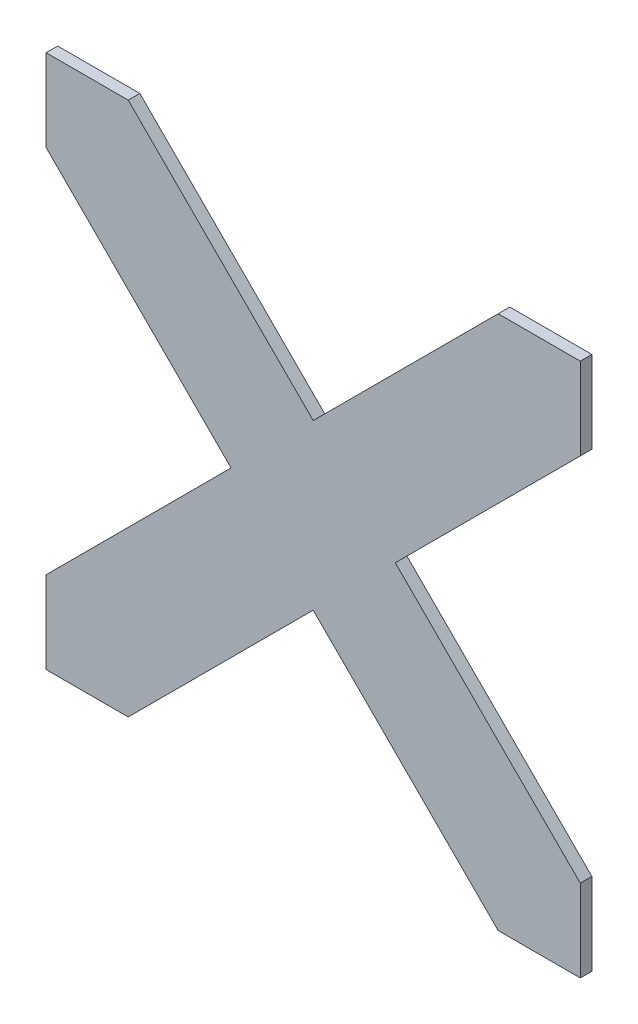
ISO-10303-21;
HEADER;
FILE_DESCRIPTION(('STEP AP214'),'2;1');
FILE_NAME('part.step','',(''),(''),'','','');
FILE_SCHEMA(('AUTOMOTIVE_DESIGN { 1 0 10303 214 1 1 1 1 }'));
ENDSEC;
DATA;
#1=APPLICATION_CONTEXT('core data for automotive mechanical design processes');
#2=APPLICATION_PROTOCOL_DEFINITION('international standard','automotive_design',2000,#1);
#3=PRODUCT_CONTEXT('',#1,'mechanical');
#4=PRODUCT('Part','Part','',(#3));
#5=PRODUCT_RELATED_PRODUCT_CATEGORY('part','',(#4));
#6=PRODUCT_DEFINITION_FORMATION('','',#4);
#7=PRODUCT_DEFINITION_CONTEXT('part definition',#1,'design');
#8=PRODUCT_DEFINITION('design','',#6,#7);
#9=PRODUCT_DEFINITION_SHAPE('','',#8);
#10=(LENGTH_UNIT() NAMED_UNIT(*) SI_UNIT(.MILLI.,.METRE.));
#11=(NAMED_UNIT(*) PLANE_ANGLE_UNIT() SI_UNIT($,.RADIAN.));
#12=(NAMED_UNIT(*) SI_UNIT($,.STERADIAN.) SOLID_ANGLE_UNIT());
#13=UNCERTAINTY_MEASURE_WITH_UNIT(LENGTH_MEASURE(1.E-05),#10,'distance_accuracy_value','');
#14=(GEOMETRIC_REPRESENTATION_CONTEXT(3) GLOBAL_UNCERTAINTY_ASSIGNED_CONTEXT((#13)) GLOBAL_UNIT_ASSIGNED_CONTEXT((#10,
#11,#12)) REPRESENTATION_CONTEXT('',''));
#15=CARTESIAN_POINT('',(0.,0.,0.));
#16=DIRECTION('',(0.,0.,1.));
#17=DIRECTION('',(1.,0.,0.));
#18=AXIS2_PLACEMENT_3D('',#15,#16,#17);
#19=CARTESIAN_POINT('',(17.0245602604753,-7.88294072519122,3.));
#20=DIRECTION('',(0.707106781186545,0.707106781186549,0.));
#21=DIRECTION('',(-0.70710678118655,0.707106781186545,0.));
#22=AXIS2_PLACEMENT_3D('',#19,#20,#21);
#23=PLANE('',#22);
#24=DIRECTION('',(0.,0.,1.));
#25=VECTOR('',#24,1.);
#26=CARTESIAN_POINT('',(-30.7622363039291,39.9038558392129,3.));
#27=LINE('',#26,#25);
#28=CARTESIAN_POINT('',(-30.7622363039291,39.9038558392129,0.));
#29=VERTEX_POINT('',#28);
#30=CARTESIAN_POINT('',(-30.7622363039291,39.9038558392129,3.));
#31=VERTEX_POINT('',#30);
#32=EDGE_CURVE('E164',#29,#31,#27,.T.);
#33=ORIENTED_EDGE('',*,*,#32,.F.);
#34=DIRECTION('',(0.70710678118655,-0.707106781186545,0.));
#35=VECTOR('',#34,1.);
#36=CARTESIAN_POINT('',(17.0245602604753,-7.88294072519122,0.));
#37=LINE('',#36,#35);
#38=CARTESIAN_POINT('',(17.0245602604753,-7.88294072519122,0.));
#39=VERTEX_POINT('',#38);
#40=EDGE_CURVE('E234',#29,#39,#37,.T.);
#41=ORIENTED_EDGE('',*,*,#40,.T.);
#42=DIRECTION('',(0.,0.,-1.));
#43=VECTOR('',#42,1.);
#44=CARTESIAN_POINT('',(17.0245602604753,-7.88294072519122,3.));
#45=LINE('',#44,#43);
#46=CARTESIAN_POINT('',(17.0245602604753,-7.88294072519122,3.));
#47=VERTEX_POINT('',#46);
#48=EDGE_CURVE('E258',#47,#39,#45,.T.);
#49=ORIENTED_EDGE('',*,*,#48,.F.);
#50=DIRECTION('',(0.70710678118655,-0.707106781186545,0.));
#51=VECTOR('',#50,1.);
#52=CARTESIAN_POINT('',(17.0245602604753,-7.88294072519122,3.));
#53=LINE('',#52,#51);
#54=EDGE_CURVE('E214',#31,#47,#53,.T.);
#55=ORIENTED_EDGE('',*,*,#54,.F.);
#56=EDGE_LOOP('',(#33,#41,#49,#55));
#57=FACE_BOUND('',#56,.T.);
#58=ADVANCED_FACE('F39',(#57),#23,.F.);
#59=DIRECTION('',(0.,0.,-1.));
#60=VECTOR('',#59,1.);
#61=CARTESIAN_POINT('',(-51.9754397395256,61.1170592748093,3.));
#62=LINE('',#61,#60);
#63=CARTESIAN_POINT('',(-51.9754397395256,61.1170592748093,3.));
#64=VERTEX_POINT('',#63);
#65=CARTESIAN_POINT('',(-51.9754397395256,61.1170592748093,0.));
#66=VERTEX_POINT('',#65);
#67=EDGE_CURVE('E191',#64,#66,#62,.T.);
#68=ORIENTED_EDGE('',*,*,#67,.F.);
#69=CARTESIAN_POINT('',(-99.7622363039289,108.903855839212,3.));
#70=VERTEX_POINT('',#69);
#71=EDGE_CURVE('E215',#70,#64,#53,.T.);
#72=ORIENTED_EDGE('',*,*,#71,.F.);
#73=DIRECTION('',(0.,0.,-1.));
#74=VECTOR('',#73,1.);
#75=CARTESIAN_POINT('',(-99.7622363039289,108.903855839212,3.));
#76=LINE('',#75,#74);
#77=CARTESIAN_POINT('',(-99.7622363039289,108.903855839212,0.));
#78=VERTEX_POINT('',#77);
#79=EDGE_CURVE('E48',#70,#78,#76,.T.);
#80=ORIENTED_EDGE('',*,*,#79,.T.);
#81=EDGE_CURVE('E235',#78,#66,#37,.T.);
#82=ORIENTED_EDGE('',*,*,#81,.T.);
#83=EDGE_LOOP('',(#68,#72,#80,#82));
#84=FACE_BOUND('',#83,.T.);
#85=ADVANCED_FACE('F267',(#84),#23,.F.);
#86=CARTESIAN_POINT('',(-78.5490328683317,130.117059274808,3.));
#87=DIRECTION('',(-0.707106781186546,-0.707106781186549,0.));
#88=DIRECTION('',(0.707106781186549,-0.707106781186546,0.));
#89=AXIS2_PLACEMENT_3D('',#86,#87,#88);
#90=PLANE('',#89);
#91=DIRECTION('',(0.,0.,-1.));
#92=VECTOR('',#91,1.);
#93=CARTESIAN_POINT('',(-9.54903286833246,61.1170592748091,3.));
#94=LINE('',#93,#92);
#95=CARTESIAN_POINT('',(-9.54903286833245,61.1170592748092,3.));
#96=VERTEX_POINT('',#95);
#97=CARTESIAN_POINT('',(-9.54903286833245,61.1170592748092,0.));
#98=VERTEX_POINT('',#97);
#99=EDGE_CURVE('E63',#96,#98,#94,.T.);
#100=ORIENTED_EDGE('',*,*,#99,.F.);
#101=DIRECTION('',(-0.707106781186549,0.707106781186546,0.));
#102=VECTOR('',#101,1.);
#103=CARTESIAN_POINT('',(-78.5490328683317,130.117059274808,3.));
#104=LINE('',#103,#102);
#105=CARTESIAN_POINT('',(38.2377636960709,13.330262710406,3.));
#106=VERTEX_POINT('',#105);
#107=EDGE_CURVE('E224',#106,#96,#104,.T.);
#108=ORIENTED_EDGE('',*,*,#107,.F.);
#109=DIRECTION('',(0.,0.,-1.));
#110=VECTOR('',#109,1.);
#111=CARTESIAN_POINT('',(38.2377636960709,13.330262710406,3.));
#112=LINE('',#111,#110);
#113=CARTESIAN_POINT('',(38.2377636960709,13.330262710406,0.));
#114=VERTEX_POINT('',#113);
#115=EDGE_CURVE('E250',#106,#114,#112,.T.);
#116=ORIENTED_EDGE('',*,*,#115,.T.);
#117=DIRECTION('',(-0.707106781186549,0.707106781186546,0.));
#118=VECTOR('',#117,1.);
#119=CARTESIAN_POINT('',(-78.5490328683317,130.117059274808,0.));
#120=LINE('',#119,#118);
#121=EDGE_CURVE('E211',#114,#98,#120,.T.);
#122=ORIENTED_EDGE('',*,*,#121,.T.);
#123=EDGE_LOOP('',(#100,#108,#116,#122));
#124=FACE_BOUND('',#123,.T.);
#125=ADVANCED_FACE('F343',(#124),#90,.F.);
#126=DIRECTION('',(0.,0.,1.));
#127=VECTOR('',#126,1.);
#128=CARTESIAN_POINT('',(-30.7622363039289,82.3302627104055,3.));
#129=LINE('',#128,#127);
#130=CARTESIAN_POINT('',(-30.762236303929,82.3302627104055,0.));
#131=VERTEX_POINT('',#130);
#132=CARTESIAN_POINT('',(-30.7622363039289,82.3302627104055,3.));
#133=VERTEX_POINT('',#132);
#134=EDGE_CURVE('E186',#131,#133,#129,.T.);
#135=ORIENTED_EDGE('',*,*,#134,.F.);
#136=CARTESIAN_POINT('',(-78.5490328683317,130.117059274808,0.));
#137=VERTEX_POINT('',#136);
#138=EDGE_CURVE('E244',#131,#137,#120,.T.);
#139=ORIENTED_EDGE('',*,*,#138,.T.);
#140=DIRECTION('',(0.,0.,-1.));
#141=VECTOR('',#140,1.);
#142=CARTESIAN_POINT('',(-78.5490328683317,130.117059274808,3.));
#143=LINE('',#142,#141);
#144=CARTESIAN_POINT('',(-78.5490328683317,130.117059274808,3.));
#145=VERTEX_POINT('',#144);
#146=EDGE_CURVE('E227',#145,#137,#143,.T.);
#147=ORIENTED_EDGE('',*,*,#146,.F.);
#148=EDGE_CURVE('E55',#133,#145,#104,.T.);
#149=ORIENTED_EDGE('',*,*,#148,.F.);
#150=EDGE_LOOP('',(#135,#139,#147,#149));
#151=FACE_BOUND('',#150,.T.);
#152=ADVANCED_FACE('F357',(#151),#90,.F.);
#153=CARTESIAN_POINT('',(-78.5490328683317,130.117059274808,3.));
#154=DIRECTION('',(0.,-1.,0.));
#155=DIRECTION('',(1.,0.,0.));
#156=AXIS2_PLACEMENT_3D('',#153,#154,#155);
#157=PLANE('',#156);
#158=DIRECTION('',(-1.,0.,0.));
#159=VECTOR('',#158,1.);
#160=CARTESIAN_POINT('',(-78.5490328683317,130.117059274808,0.));
#161=LINE('',#160,#159);
#162=CARTESIAN_POINT('',(-99.7622363039289,130.117059274808,0.));
#163=VERTEX_POINT('',#162);
#164=EDGE_CURVE('E205',#137,#163,#161,.T.);
#165=ORIENTED_EDGE('',*,*,#164,.T.);
#166=DIRECTION('',(0.,0.,-1.));
#167=VECTOR('',#166,1.);
#168=CARTESIAN_POINT('',(-99.7622363039289,130.117059274808,3.));
#169=LINE('',#168,#167);
#170=CARTESIAN_POINT('',(-99.7622363039289,130.117059274808,3.));
#171=VERTEX_POINT('',#170);
#172=EDGE_CURVE('E11',#171,#163,#169,.T.);
#173=ORIENTED_EDGE('',*,*,#172,.F.);
#174=DIRECTION('',(-1.,0.,0.));
#175=VECTOR('',#174,1.);
#176=CARTESIAN_POINT('',(-78.5490328683317,130.117059274808,3.));
#177=LINE('',#176,#175);
#178=EDGE_CURVE('E206',#145,#171,#177,.T.);
#179=ORIENTED_EDGE('',*,*,#178,.F.);
#180=ORIENTED_EDGE('',*,*,#146,.T.);
#181=EDGE_LOOP('',(#165,#173,#179,#180));
#182=FACE_BOUND('',#181,.T.);
#183=ADVANCED_FACE('F41',(#182),#157,.F.);
#184=CARTESIAN_POINT('',(-99.7622363039289,130.117059274808,3.));
#185=DIRECTION('',(1.,0.,0.));
#186=DIRECTION('',(0.,0.,-1.));
#187=AXIS2_PLACEMENT_3D('',#184,#185,#186);
#188=PLANE('',#187);
#189=DIRECTION('',(0.,-1.,0.));
#190=VECTOR('',#189,1.);
#191=CARTESIAN_POINT('',(-99.7622363039289,130.117059274808,0.));
#192=LINE('',#191,#190);
#193=EDGE_CURVE('E231',#163,#78,#192,.T.);
#194=ORIENTED_EDGE('',*,*,#193,.T.);
#195=ORIENTED_EDGE('',*,*,#79,.F.);
#196=DIRECTION('',(0.,-1.,0.));
#197=VECTOR('',#196,1.);
#198=CARTESIAN_POINT('',(-99.7622363039289,130.117059274808,3.));
#199=LINE('',#198,#197);
#200=EDGE_CURVE('E210',#171,#70,#199,.T.);
#201=ORIENTED_EDGE('',*,*,#200,.F.);
#202=ORIENTED_EDGE('',*,*,#172,.T.);
#203=EDGE_LOOP('',(#194,#195,#201,#202));
#204=FACE_BOUND('',#203,.T.);
#205=ADVANCED_FACE('F363',(#204),#188,.F.);
#206=CARTESIAN_POINT('',(17.0245602604753,-7.88294072519122,3.));
#207=DIRECTION('',(0.,1.,0.));
#208=DIRECTION('',(-1.,0.,0.));
#209=AXIS2_PLACEMENT_3D('',#206,#207,#208);
#210=PLANE('',#209);
#211=DIRECTION('',(1.,0.,0.));
#212=VECTOR('',#211,1.);
#213=CARTESIAN_POINT('',(17.0245602604753,-7.88294072519122,0.));
#214=LINE('',#213,#212);
#215=CARTESIAN_POINT('',(38.2377636960709,-7.88294072518953,0.));
#216=VERTEX_POINT('',#215);
#217=EDGE_CURVE('E238',#39,#216,#214,.T.);
#218=ORIENTED_EDGE('',*,*,#217,.T.);
#219=DIRECTION('',(0.,0.,-1.));
#220=VECTOR('',#219,1.);
#221=CARTESIAN_POINT('',(38.2377636960709,-7.88294072518953,3.));
#222=LINE('',#221,#220);
#223=CARTESIAN_POINT('',(38.2377636960709,-7.88294072518953,3.));
#224=VERTEX_POINT('',#223);
#225=EDGE_CURVE('E254',#224,#216,#222,.T.);
#226=ORIENTED_EDGE('',*,*,#225,.F.);
#227=DIRECTION('',(1.,0.,0.));
#228=VECTOR('',#227,1.);
#229=CARTESIAN_POINT('',(17.0245602604753,-7.88294072519122,3.));
#230=LINE('',#229,#228);
#231=EDGE_CURVE('E218',#47,#224,#230,.T.);
#232=ORIENTED_EDGE('',*,*,#231,.F.);
#233=ORIENTED_EDGE('',*,*,#48,.T.);
#234=EDGE_LOOP('',(#218,#226,#232,#233));
#235=FACE_BOUND('',#234,.T.);
#236=ADVANCED_FACE('F351',(#235),#210,.F.);
#237=CARTESIAN_POINT('',(38.2377636960709,-7.88294072518953,3.));
#238=DIRECTION('',(-1.,0.,0.));
#239=DIRECTION('',(0.,0.,1.));
#240=AXIS2_PLACEMENT_3D('',#237,#238,#239);
#241=PLANE('',#240);
#242=DIRECTION('',(0.,1.,0.));
#243=VECTOR('',#242,1.);
#244=CARTESIAN_POINT('',(38.2377636960709,-7.88294072518953,0.));
#245=LINE('',#244,#243);
#246=EDGE_CURVE('E241',#216,#114,#245,.T.);
#247=ORIENTED_EDGE('',*,*,#246,.T.);
#248=ORIENTED_EDGE('',*,*,#115,.F.);
#249=DIRECTION('',(0.,1.,0.));
#250=VECTOR('',#249,1.);
#251=CARTESIAN_POINT('',(38.2377636960709,-7.88294072518953,3.));
#252=LINE('',#251,#250);
#253=EDGE_CURVE('E221',#224,#106,#252,.T.);
#254=ORIENTED_EDGE('',*,*,#253,.F.);
#255=ORIENTED_EDGE('',*,*,#225,.T.);
#256=EDGE_LOOP('',(#247,#248,#254,#255));
#257=FACE_BOUND('',#256,.T.);
#258=ADVANCED_FACE('F347',(#257),#241,.F.);
#259=CARTESIAN_POINT('',(0.,0.,3.));
#260=DIRECTION('',(0.,0.,1.));
#261=DIRECTION('',(1.,0.,0.));
#262=AXIS2_PLACEMENT_3D('',#259,#260,#261);
#263=PLANE('',#262);
#264=ORIENTED_EDGE('',*,*,#71,.T.);
#265=DIRECTION('',(-0.707106781186554,-0.707106781186541,0.));
#266=VECTOR('',#265,1.);
#267=CARTESIAN_POINT('',(17.0245602604744,130.117059274808,3.));
#268=LINE('',#267,#266);
#269=CARTESIAN_POINT('',(-99.7622363039289,13.3302627104069,3.));
#270=VERTEX_POINT('',#269);
#271=EDGE_CURVE('E320',#64,#270,#268,.T.);
#272=ORIENTED_EDGE('',*,*,#271,.T.);
#273=DIRECTION('',(0.,-1.,0.));
#274=VECTOR('',#273,1.);
#275=CARTESIAN_POINT('',(-99.7622363039289,-7.88294072518953,3.));
#276=LINE('',#275,#274);
#277=CARTESIAN_POINT('',(-99.7622363039289,-7.88294072518953,3.));
#278=VERTEX_POINT('',#277);
#279=EDGE_CURVE('E175',#270,#278,#276,.T.);
#280=ORIENTED_EDGE('',*,*,#279,.T.);
#281=DIRECTION('',(1.,0.,0.));
#282=VECTOR('',#281,1.);
#283=CARTESIAN_POINT('',(-78.5490328683324,-7.88294072518953,3.));
#284=LINE('',#283,#282);
#285=CARTESIAN_POINT('',(-78.5490328683324,-7.88294072518953,3.));
#286=VERTEX_POINT('',#285);
#287=EDGE_CURVE('E171',#278,#286,#284,.T.);
#288=ORIENTED_EDGE('',*,*,#287,.T.);
#289=DIRECTION('',(0.707106781186554,0.707106781186541,0.));
#290=VECTOR('',#289,1.);
#291=CARTESIAN_POINT('',(-78.5490328683324,-7.88294072518953,3.));
#292=LINE('',#291,#290);
#293=EDGE_CURVE('E156',#286,#31,#292,.T.);
#294=ORIENTED_EDGE('',*,*,#293,.T.);
#295=ORIENTED_EDGE('',*,*,#54,.T.);
#296=ORIENTED_EDGE('',*,*,#231,.T.);
#297=ORIENTED_EDGE('',*,*,#253,.T.);
#298=ORIENTED_EDGE('',*,*,#107,.T.);
#299=CARTESIAN_POINT('',(38.2377636960709,108.903855839212,3.));
#300=VERTEX_POINT('',#299);
#301=EDGE_CURVE('E168',#96,#300,#292,.T.);
#302=ORIENTED_EDGE('',*,*,#301,.T.);
#303=DIRECTION('',(0.,1.,0.));
#304=VECTOR('',#303,1.);
#305=CARTESIAN_POINT('',(38.2377636960709,130.117059274808,3.));
#306=LINE('',#305,#304);
#307=CARTESIAN_POINT('',(38.2377636960709,130.117059274808,3.));
#308=VERTEX_POINT('',#307);
#309=EDGE_CURVE('E167',#300,#308,#306,.T.);
#310=ORIENTED_EDGE('',*,*,#309,.T.);
#311=DIRECTION('',(-1.,0.,0.));
#312=VECTOR('',#311,1.);
#313=CARTESIAN_POINT('',(17.0245602604744,130.117059274808,3.));
#314=LINE('',#313,#312);
#315=CARTESIAN_POINT('',(17.0245602604744,130.117059274808,3.));
#316=VERTEX_POINT('',#315);
#317=EDGE_CURVE('E308',#308,#316,#314,.T.);
#318=ORIENTED_EDGE('',*,*,#317,.T.);
#319=EDGE_CURVE('E318',#316,#133,#268,.T.);
#320=ORIENTED_EDGE('',*,*,#319,.T.);
#321=ORIENTED_EDGE('',*,*,#148,.T.);
#322=ORIENTED_EDGE('',*,*,#178,.T.);
#323=ORIENTED_EDGE('',*,*,#200,.T.);
#324=EDGE_LOOP('',(#264,#272,#280,#288,#294,#295,#296,#297,#298,#302,#310,#318,#320,#321,#322,#323));
#325=FACE_BOUND('',#324,.T.);
#326=ADVANCED_FACE('F173',(#325),#263,.T.);
#327=CARTESIAN_POINT('',(0.,0.,0.));
#328=DIRECTION('',(0.,0.,1.));
#329=DIRECTION('',(1.,0.,0.));
#330=AXIS2_PLACEMENT_3D('',#327,#328,#329);
#331=PLANE('',#330);
#332=ORIENTED_EDGE('',*,*,#138,.F.);
#333=DIRECTION('',(-0.707106781186554,-0.707106781186541,0.));
#334=VECTOR('',#333,1.);
#335=CARTESIAN_POINT('',(17.0245602604744,130.117059274808,0.));
#336=LINE('',#335,#334);
#337=CARTESIAN_POINT('',(17.0245602604744,130.117059274808,0.));
#338=VERTEX_POINT('',#337);
#339=EDGE_CURVE('E279',#338,#131,#336,.T.);
#340=ORIENTED_EDGE('',*,*,#339,.F.);
#341=DIRECTION('',(-1.,0.,0.));
#342=VECTOR('',#341,1.);
#343=CARTESIAN_POINT('',(17.0245602604744,130.117059274808,0.));
#344=LINE('',#343,#342);
#345=CARTESIAN_POINT('',(38.2377636960709,130.117059274808,0.));
#346=VERTEX_POINT('',#345);
#347=EDGE_CURVE('E280',#346,#338,#344,.T.);
#348=ORIENTED_EDGE('',*,*,#347,.F.);
#349=DIRECTION('',(0.,1.,0.));
#350=VECTOR('',#349,1.);
#351=CARTESIAN_POINT('',(38.2377636960709,130.117059274808,0.));
#352=LINE('',#351,#350);
#353=CARTESIAN_POINT('',(38.2377636960709,108.903855839212,0.));
#354=VERTEX_POINT('',#353);
#355=EDGE_CURVE('E285',#354,#346,#352,.T.);
#356=ORIENTED_EDGE('',*,*,#355,.F.);
#357=DIRECTION('',(0.707106781186554,0.707106781186541,0.));
#358=VECTOR('',#357,1.);
#359=CARTESIAN_POINT('',(-78.5490328683324,-7.88294072518953,0.));
#360=LINE('',#359,#358);
#361=EDGE_CURVE('E330',#98,#354,#360,.T.);
#362=ORIENTED_EDGE('',*,*,#361,.F.);
#363=ORIENTED_EDGE('',*,*,#121,.F.);
#364=ORIENTED_EDGE('',*,*,#246,.F.);
#365=ORIENTED_EDGE('',*,*,#217,.F.);
#366=ORIENTED_EDGE('',*,*,#40,.F.);
#367=CARTESIAN_POINT('',(-78.5490328683324,-7.88294072518953,0.));
#368=VERTEX_POINT('',#367);
#369=EDGE_CURVE('E331',#368,#29,#360,.T.);
#370=ORIENTED_EDGE('',*,*,#369,.F.);
#371=DIRECTION('',(1.,0.,0.));
#372=VECTOR('',#371,1.);
#373=CARTESIAN_POINT('',(-78.5490328683324,-7.88294072518953,0.));
#374=LINE('',#373,#372);
#375=CARTESIAN_POINT('',(-99.7622363039289,-7.88294072518953,0.));
#376=VERTEX_POINT('',#375);
#377=EDGE_CURVE('E184',#376,#368,#374,.T.);
#378=ORIENTED_EDGE('',*,*,#377,.F.);
#379=DIRECTION('',(0.,-1.,0.));
#380=VECTOR('',#379,1.);
#381=CARTESIAN_POINT('',(-99.7622363039289,-7.88294072518953,0.));
#382=LINE('',#381,#380);
#383=CARTESIAN_POINT('',(-99.7622363039289,13.3302627104069,0.));
#384=VERTEX_POINT('',#383);
#385=EDGE_CURVE('E180',#384,#376,#382,.T.);
#386=ORIENTED_EDGE('',*,*,#385,.F.);
#387=EDGE_CURVE('E274',#66,#384,#336,.T.);
#388=ORIENTED_EDGE('',*,*,#387,.F.);
#389=ORIENTED_EDGE('',*,*,#81,.F.);
#390=ORIENTED_EDGE('',*,*,#193,.F.);
#391=ORIENTED_EDGE('',*,*,#164,.F.);
#392=EDGE_LOOP('',(#332,#340,#348,#356,#362,#363,#364,#365,#366,#370,#378,#386,#388,#389,#390,#391));
#393=FACE_BOUND('',#392,.T.);
#394=ADVANCED_FACE('F271',(#393),#331,.F.);
#395=CARTESIAN_POINT('',(38.2377636960709,130.117059274808,3.));
#396=DIRECTION('',(-1.,0.,0.));
#397=DIRECTION('',(0.,0.,1.));
#398=AXIS2_PLACEMENT_3D('',#395,#396,#397);
#399=PLANE('',#398);
#400=ORIENTED_EDGE('',*,*,#355,.T.);
#401=DIRECTION('',(0.,0.,-1.));
#402=VECTOR('',#401,1.);
#403=CARTESIAN_POINT('',(38.2377636960709,130.117059274808,3.));
#404=LINE('',#403,#402);
#405=EDGE_CURVE('E194',#308,#346,#404,.T.);
#406=ORIENTED_EDGE('',*,*,#405,.F.);
#407=ORIENTED_EDGE('',*,*,#309,.F.);
#408=DIRECTION('',(0.,0.,-1.));
#409=VECTOR('',#408,1.);
#410=CARTESIAN_POINT('',(38.2377636960709,108.903855839212,3.));
#411=LINE('',#410,#409);
#412=EDGE_CURVE('E187',#300,#354,#411,.T.);
#413=ORIENTED_EDGE('',*,*,#412,.T.);
#414=EDGE_LOOP('',(#400,#406,#407,#413));
#415=FACE_BOUND('',#414,.T.);
#416=ADVANCED_FACE('F334',(#415),#399,.F.);
#417=CARTESIAN_POINT('',(17.0245602604744,130.117059274808,3.));
#418=DIRECTION('',(0.,-1.,0.));
#419=DIRECTION('',(0.,0.,-1.));
#420=AXIS2_PLACEMENT_3D('',#417,#418,#419);
#421=PLANE('',#420);
#422=ORIENTED_EDGE('',*,*,#347,.T.);
#423=DIRECTION('',(0.,0.,-1.));
#424=VECTOR('',#423,1.);
#425=CARTESIAN_POINT('',(17.0245602604744,130.117059274808,3.));
#426=LINE('',#425,#424);
#427=EDGE_CURVE('E297',#316,#338,#426,.T.);
#428=ORIENTED_EDGE('',*,*,#427,.F.);
#429=ORIENTED_EDGE('',*,*,#317,.F.);
#430=ORIENTED_EDGE('',*,*,#405,.T.);
#431=EDGE_LOOP('',(#422,#428,#429,#430));
#432=FACE_BOUND('',#431,.T.);
#433=ADVANCED_FACE('F306',(#432),#421,.F.);
#434=CARTESIAN_POINT('',(17.0245602604744,130.117059274808,3.));
#435=DIRECTION('',(0.707106781186541,-0.707106781186554,0.));
#436=DIRECTION('',(0.707106781186554,0.707106781186541,0.));
#437=AXIS2_PLACEMENT_3D('',#434,#435,#436);
#438=PLANE('',#437);
#439=ORIENTED_EDGE('',*,*,#339,.T.);
#440=ORIENTED_EDGE('',*,*,#134,.T.);
#441=ORIENTED_EDGE('',*,*,#319,.F.);
#442=ORIENTED_EDGE('',*,*,#427,.T.);
#443=EDGE_LOOP('',(#439,#440,#441,#442));
#444=FACE_BOUND('',#443,.T.);
#445=ADVANCED_FACE('F315',(#444),#438,.F.);
#446=CARTESIAN_POINT('',(-78.5490328683324,-7.88294072518953,3.));
#447=DIRECTION('',(-0.707106781186541,0.707106781186554,0.));
#448=DIRECTION('',(-0.707106781186554,-0.707106781186541,0.));
#449=AXIS2_PLACEMENT_3D('',#446,#447,#448);
#450=PLANE('',#449);
#451=ORIENTED_EDGE('',*,*,#301,.F.);
#452=ORIENTED_EDGE('',*,*,#99,.T.);
#453=ORIENTED_EDGE('',*,*,#361,.T.);
#454=ORIENTED_EDGE('',*,*,#412,.F.);
#455=EDGE_LOOP('',(#451,#452,#453,#454));
#456=FACE_BOUND('',#455,.T.);
#457=ADVANCED_FACE('F338',(#456),#450,.F.);
#458=ORIENTED_EDGE('',*,*,#369,.T.);
#459=ORIENTED_EDGE('',*,*,#32,.T.);
#460=ORIENTED_EDGE('',*,*,#293,.F.);
#461=DIRECTION('',(0.,0.,-1.));
#462=VECTOR('',#461,1.);
#463=CARTESIAN_POINT('',(-78.5490328683324,-7.88294072518953,3.));
#464=LINE('',#463,#462);
#465=EDGE_CURVE('E161',#286,#368,#464,.T.);
#466=ORIENTED_EDGE('',*,*,#465,.T.);
#467=EDGE_LOOP('',(#458,#459,#460,#466));
#468=FACE_BOUND('',#467,.T.);
#469=ADVANCED_FACE('F159',(#468),#450,.F.);
#470=ORIENTED_EDGE('',*,*,#271,.F.);
#471=ORIENTED_EDGE('',*,*,#67,.T.);
#472=ORIENTED_EDGE('',*,*,#387,.T.);
#473=DIRECTION('',(0.,0.,-1.));
#474=VECTOR('',#473,1.);
#475=CARTESIAN_POINT('',(-99.7622363039289,13.3302627104069,3.));
#476=LINE('',#475,#474);
#477=EDGE_CURVE('E294',#270,#384,#476,.T.);
#478=ORIENTED_EDGE('',*,*,#477,.F.);
#479=EDGE_LOOP('',(#470,#471,#472,#478));
#480=FACE_BOUND('',#479,.T.);
#481=ADVANCED_FACE('F388',(#480),#438,.F.);
#482=CARTESIAN_POINT('',(-78.5490328683324,-7.88294072518953,3.));
#483=DIRECTION('',(0.,1.,0.));
#484=DIRECTION('',(0.,0.,1.));
#485=AXIS2_PLACEMENT_3D('',#482,#483,#484);
#486=PLANE('',#485);
#487=ORIENTED_EDGE('',*,*,#377,.T.);
#488=ORIENTED_EDGE('',*,*,#465,.F.);
#489=ORIENTED_EDGE('',*,*,#287,.F.);
#490=DIRECTION('',(0.,0.,-1.));
#491=VECTOR('',#490,1.);
#492=CARTESIAN_POINT('',(-99.7622363039289,-7.88294072518953,3.));
#493=LINE('',#492,#491);
#494=EDGE_CURVE('E291',#278,#376,#493,.T.);
#495=ORIENTED_EDGE('',*,*,#494,.T.);
#496=EDGE_LOOP('',(#487,#488,#489,#495));
#497=FACE_BOUND('',#496,.T.);
#498=ADVANCED_FACE('F182',(#497),#486,.F.);
#499=CARTESIAN_POINT('',(-99.7622363039289,-7.88294072518953,3.));
#500=DIRECTION('',(1.,0.,0.));
#501=DIRECTION('',(0.,0.,-1.));
#502=AXIS2_PLACEMENT_3D('',#499,#500,#501);
#503=PLANE('',#502);
#504=ORIENTED_EDGE('',*,*,#385,.T.);
#505=ORIENTED_EDGE('',*,*,#494,.F.);
#506=ORIENTED_EDGE('',*,*,#279,.F.);
#507=ORIENTED_EDGE('',*,*,#477,.T.);
#508=EDGE_LOOP('',(#504,#505,#506,#507));
#509=FACE_BOUND('',#508,.T.);
#510=ADVANCED_FACE('F387',(#509),#503,.F.);
#511=CLOSED_SHELL('',(#58,#85,#125,#152,#183,#205,#236,#258,#326,#394,#416,#433,#445,#457,#469,
#481,#498,#510));
#512=MANIFOLD_SOLID_BREP('B2',#511);
#513=ADVANCED_BREP_SHAPE_REPRESENTATION('',(#18,#512),#14);
#514=SHAPE_DEFINITION_REPRESENTATION(#9,#513);
ENDSEC;
END-ISO-10303-21;
